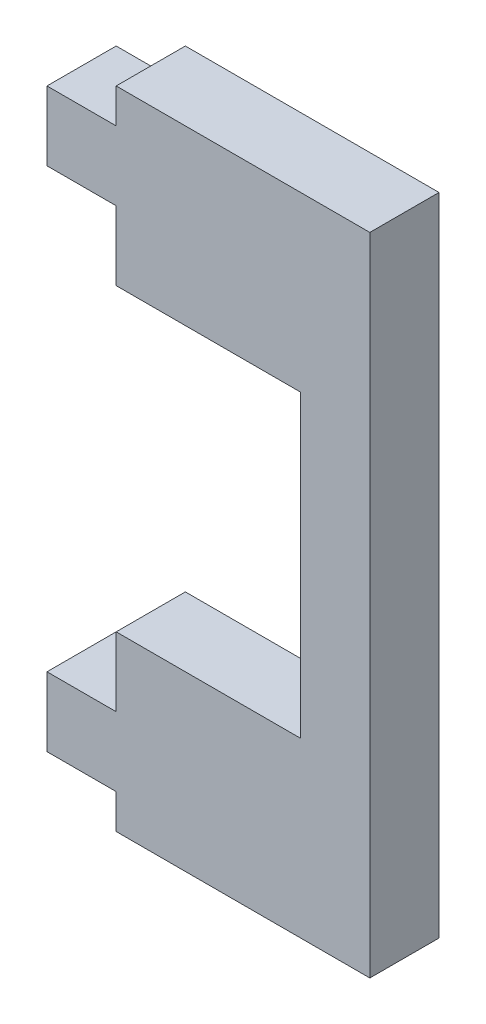
ISO-10303-21;
HEADER;
FILE_DESCRIPTION(('STEP AP214'),'2;1');
FILE_NAME('part.step','',(''),(''),'','','');
FILE_SCHEMA(('AUTOMOTIVE_DESIGN { 1 0 10303 214 1 1 1 1 }'));
ENDSEC;
DATA;
#1=APPLICATION_CONTEXT('core data for automotive mechanical design processes');
#2=APPLICATION_PROTOCOL_DEFINITION('international standard','automotive_design',2000,#1);
#3=PRODUCT_CONTEXT('',#1,'mechanical');
#4=PRODUCT('Part','Part','',(#3));
#5=PRODUCT_RELATED_PRODUCT_CATEGORY('part','',(#4));
#6=PRODUCT_DEFINITION_FORMATION('','',#4);
#7=PRODUCT_DEFINITION_CONTEXT('part definition',#1,'design');
#8=PRODUCT_DEFINITION('design','',#6,#7);
#9=PRODUCT_DEFINITION_SHAPE('','',#8);
#10=(LENGTH_UNIT() NAMED_UNIT(*) SI_UNIT(.MILLI.,.METRE.));
#11=(NAMED_UNIT(*) PLANE_ANGLE_UNIT() SI_UNIT($,.RADIAN.));
#12=(NAMED_UNIT(*) SI_UNIT($,.STERADIAN.) SOLID_ANGLE_UNIT());
#13=UNCERTAINTY_MEASURE_WITH_UNIT(LENGTH_MEASURE(1.E-05),#10,'distance_accuracy_value','');
#14=(GEOMETRIC_REPRESENTATION_CONTEXT(3) GLOBAL_UNCERTAINTY_ASSIGNED_CONTEXT((#13)) GLOBAL_UNIT_ASSIGNED_CONTEXT((#10,
#11,#12)) REPRESENTATION_CONTEXT('',''));
#15=CARTESIAN_POINT('',(0.,0.,0.));
#16=DIRECTION('',(0.,0.,1.));
#17=DIRECTION('',(1.,0.,0.));
#18=AXIS2_PLACEMENT_3D('',#15,#16,#17);
#19=CARTESIAN_POINT('',(3.,14.,3.));
#20=DIRECTION('',(-1.,0.,0.));
#21=DIRECTION('',(0.,-1.,0.));
#22=AXIS2_PLACEMENT_3D('',#19,#20,#21);
#23=PLANE('',#22);
#24=DIRECTION('',(0.,1.,0.));
#25=VECTOR('',#24,1.);
#26=CARTESIAN_POINT('',(3.,14.,0.));
#27=LINE('',#26,#25);
#28=CARTESIAN_POINT('',(3.,-14.,0.));
#29=VERTEX_POINT('',#28);
#30=CARTESIAN_POINT('',(3.,14.,0.));
#31=VERTEX_POINT('',#30);
#32=EDGE_CURVE('E144',#29,#31,#27,.T.);
#33=ORIENTED_EDGE('',*,*,#32,.T.);
#34=DIRECTION('',(0.,0.,-1.));
#35=VECTOR('',#34,1.);
#36=CARTESIAN_POINT('',(3.,14.,3.));
#37=LINE('',#36,#35);
#38=CARTESIAN_POINT('',(3.,14.,3.));
#39=VERTEX_POINT('',#38);
#40=EDGE_CURVE('E11',#39,#31,#37,.T.);
#41=ORIENTED_EDGE('',*,*,#40,.F.);
#42=DIRECTION('',(0.,1.,0.));
#43=VECTOR('',#42,1.);
#44=CARTESIAN_POINT('',(3.,14.,3.));
#45=LINE('',#44,#43);
#46=CARTESIAN_POINT('',(3.,-14.,3.));
#47=VERTEX_POINT('',#46);
#48=EDGE_CURVE('E101',#47,#39,#45,.T.);
#49=ORIENTED_EDGE('',*,*,#48,.F.);
#50=DIRECTION('',(0.,0.,-1.));
#51=VECTOR('',#50,1.);
#52=CARTESIAN_POINT('',(3.,-14.,3.));
#53=LINE('',#52,#51);
#54=EDGE_CURVE('E218',#47,#29,#53,.T.);
#55=ORIENTED_EDGE('',*,*,#54,.T.);
#56=EDGE_LOOP('',(#33,#41,#49,#55));
#57=FACE_BOUND('',#56,.T.);
#58=ADVANCED_FACE('F41',(#57),#23,.F.);
#59=CARTESIAN_POINT('',(-8.,14.,3.));
#60=DIRECTION('',(0.,-1.,0.));
#61=DIRECTION('',(1.,0.,0.));
#62=AXIS2_PLACEMENT_3D('',#59,#60,#61);
#63=PLANE('',#62);
#64=DIRECTION('',(-1.,0.,0.));
#65=VECTOR('',#64,1.);
#66=CARTESIAN_POINT('',(-8.,14.,0.));
#67=LINE('',#66,#65);
#68=CARTESIAN_POINT('',(-8.,14.,0.));
#69=VERTEX_POINT('',#68);
#70=EDGE_CURVE('E146',#31,#69,#67,.T.);
#71=ORIENTED_EDGE('',*,*,#70,.T.);
#72=DIRECTION('',(0.,0.,-1.));
#73=VECTOR('',#72,1.);
#74=CARTESIAN_POINT('',(-8.,14.,3.));
#75=LINE('',#74,#73);
#76=CARTESIAN_POINT('',(-8.,14.,3.));
#77=VERTEX_POINT('',#76);
#78=EDGE_CURVE('E49',#77,#69,#75,.T.);
#79=ORIENTED_EDGE('',*,*,#78,.F.);
#80=DIRECTION('',(-1.,0.,0.));
#81=VECTOR('',#80,1.);
#82=CARTESIAN_POINT('',(-8.,14.,3.));
#83=LINE('',#82,#81);
#84=EDGE_CURVE('E195',#39,#77,#83,.T.);
#85=ORIENTED_EDGE('',*,*,#84,.F.);
#86=ORIENTED_EDGE('',*,*,#40,.T.);
#87=EDGE_LOOP('',(#71,#79,#85,#86));
#88=FACE_BOUND('',#87,.T.);
#89=ADVANCED_FACE('F316',(#88),#63,.F.);
#90=CARTESIAN_POINT('',(-8.,12.5,3.));
#91=DIRECTION('',(1.,0.,0.));
#92=DIRECTION('',(0.,0.,-1.));
#93=AXIS2_PLACEMENT_3D('',#90,#91,#92);
#94=PLANE('',#93);
#95=DIRECTION('',(0.,-1.,0.));
#96=VECTOR('',#95,1.);
#97=CARTESIAN_POINT('',(-8.,12.5,0.));
#98=LINE('',#97,#96);
#99=CARTESIAN_POINT('',(-8.,12.5,0.));
#100=VERTEX_POINT('',#99);
#101=EDGE_CURVE('E149',#69,#100,#98,.T.);
#102=ORIENTED_EDGE('',*,*,#101,.T.);
#103=DIRECTION('',(0.,0.,-1.));
#104=VECTOR('',#103,1.);
#105=CARTESIAN_POINT('',(-8.,12.5,3.));
#106=LINE('',#105,#104);
#107=CARTESIAN_POINT('',(-8.,12.5,3.));
#108=VERTEX_POINT('',#107);
#109=EDGE_CURVE('E167',#108,#100,#106,.T.);
#110=ORIENTED_EDGE('',*,*,#109,.F.);
#111=DIRECTION('',(0.,-1.,0.));
#112=VECTOR('',#111,1.);
#113=CARTESIAN_POINT('',(-8.,12.5,3.));
#114=LINE('',#113,#112);
#115=EDGE_CURVE('E176',#77,#108,#114,.T.);
#116=ORIENTED_EDGE('',*,*,#115,.F.);
#117=ORIENTED_EDGE('',*,*,#78,.T.);
#118=EDGE_LOOP('',(#102,#110,#116,#117));
#119=FACE_BOUND('',#118,.T.);
#120=ADVANCED_FACE('F174',(#119),#94,.F.);
#121=CARTESIAN_POINT('',(-8.,12.5,3.));
#122=DIRECTION('',(0.,-1.,0.));
#123=DIRECTION('',(1.,0.,0.));
#124=AXIS2_PLACEMENT_3D('',#121,#122,#123);
#125=PLANE('',#124);
#126=DIRECTION('',(-1.,0.,0.));
#127=VECTOR('',#126,1.);
#128=CARTESIAN_POINT('',(-8.,12.5,0.));
#129=LINE('',#128,#127);
#130=CARTESIAN_POINT('',(-11.,12.5,0.));
#131=VERTEX_POINT('',#130);
#132=EDGE_CURVE('E151',#100,#131,#129,.T.);
#133=ORIENTED_EDGE('',*,*,#132,.T.);
#134=DIRECTION('',(0.,0.,-1.));
#135=VECTOR('',#134,1.);
#136=CARTESIAN_POINT('',(-11.,12.5,3.));
#137=LINE('',#136,#135);
#138=CARTESIAN_POINT('',(-11.,12.5,3.));
#139=VERTEX_POINT('',#138);
#140=EDGE_CURVE('E164',#139,#131,#137,.T.);
#141=ORIENTED_EDGE('',*,*,#140,.F.);
#142=DIRECTION('',(-1.,0.,0.));
#143=VECTOR('',#142,1.);
#144=CARTESIAN_POINT('',(-8.,12.5,3.));
#145=LINE('',#144,#143);
#146=EDGE_CURVE('E191',#108,#139,#145,.T.);
#147=ORIENTED_EDGE('',*,*,#146,.F.);
#148=ORIENTED_EDGE('',*,*,#109,.T.);
#149=EDGE_LOOP('',(#133,#141,#147,#148));
#150=FACE_BOUND('',#149,.T.);
#151=ADVANCED_FACE('F187',(#150),#125,.F.);
#152=CARTESIAN_POINT('',(-11.,12.5,3.));
#153=DIRECTION('',(1.,0.,0.));
#154=DIRECTION('',(0.,1.,0.));
#155=AXIS2_PLACEMENT_3D('',#152,#153,#154);
#156=PLANE('',#155);
#157=DIRECTION('',(0.,-1.,0.));
#158=VECTOR('',#157,1.);
#159=CARTESIAN_POINT('',(-11.,12.5,0.));
#160=LINE('',#159,#158);
#161=CARTESIAN_POINT('',(-11.,9.5,0.));
#162=VERTEX_POINT('',#161);
#163=EDGE_CURVE('E153',#131,#162,#160,.T.);
#164=ORIENTED_EDGE('',*,*,#163,.T.);
#165=DIRECTION('',(0.,0.,-1.));
#166=VECTOR('',#165,1.);
#167=CARTESIAN_POINT('',(-11.,9.5,3.));
#168=LINE('',#167,#166);
#169=CARTESIAN_POINT('',(-11.,9.5,3.));
#170=VERTEX_POINT('',#169);
#171=EDGE_CURVE('E133',#170,#162,#168,.T.);
#172=ORIENTED_EDGE('',*,*,#171,.F.);
#173=DIRECTION('',(0.,-1.,0.));
#174=VECTOR('',#173,1.);
#175=CARTESIAN_POINT('',(-11.,12.5,3.));
#176=LINE('',#175,#174);
#177=EDGE_CURVE('E124',#139,#170,#176,.T.);
#178=ORIENTED_EDGE('',*,*,#177,.F.);
#179=ORIENTED_EDGE('',*,*,#140,.T.);
#180=EDGE_LOOP('',(#164,#172,#178,#179));
#181=FACE_BOUND('',#180,.T.);
#182=ADVANCED_FACE('F190',(#181),#156,.F.);
#183=CARTESIAN_POINT('',(-8.,9.5,3.));
#184=DIRECTION('',(0.,1.,0.));
#185=DIRECTION('',(-1.,0.,0.));
#186=AXIS2_PLACEMENT_3D('',#183,#184,#185);
#187=PLANE('',#186);
#188=DIRECTION('',(1.,0.,0.));
#189=VECTOR('',#188,1.);
#190=CARTESIAN_POINT('',(-8.,9.5,0.));
#191=LINE('',#190,#189);
#192=CARTESIAN_POINT('',(-8.,9.5,0.));
#193=VERTEX_POINT('',#192);
#194=EDGE_CURVE('E132',#162,#193,#191,.T.);
#195=ORIENTED_EDGE('',*,*,#194,.T.);
#196=DIRECTION('',(0.,0.,-1.));
#197=VECTOR('',#196,1.);
#198=CARTESIAN_POINT('',(-8.,9.5,3.));
#199=LINE('',#198,#197);
#200=CARTESIAN_POINT('',(-8.,9.5,3.));
#201=VERTEX_POINT('',#200);
#202=EDGE_CURVE('E129',#201,#193,#199,.T.);
#203=ORIENTED_EDGE('',*,*,#202,.F.);
#204=DIRECTION('',(1.,0.,0.));
#205=VECTOR('',#204,1.);
#206=CARTESIAN_POINT('',(-8.,9.5,3.));
#207=LINE('',#206,#205);
#208=EDGE_CURVE('E118',#170,#201,#207,.T.);
#209=ORIENTED_EDGE('',*,*,#208,.F.);
#210=ORIENTED_EDGE('',*,*,#171,.T.);
#211=EDGE_LOOP('',(#195,#203,#209,#210));
#212=FACE_BOUND('',#211,.T.);
#213=ADVANCED_FACE('F130',(#212),#187,.F.);
#214=CARTESIAN_POINT('',(-8.,6.5,3.));
#215=DIRECTION('',(1.,0.,0.));
#216=DIRECTION('',(0.,1.,0.));
#217=AXIS2_PLACEMENT_3D('',#214,#215,#216);
#218=PLANE('',#217);
#219=DIRECTION('',(0.,-1.,0.));
#220=VECTOR('',#219,1.);
#221=CARTESIAN_POINT('',(-8.,6.5,0.));
#222=LINE('',#221,#220);
#223=CARTESIAN_POINT('',(-8.,6.5,0.));
#224=VERTEX_POINT('',#223);
#225=EDGE_CURVE('E87',#193,#224,#222,.T.);
#226=ORIENTED_EDGE('',*,*,#225,.T.);
#227=DIRECTION('',(0.,0.,-1.));
#228=VECTOR('',#227,1.);
#229=CARTESIAN_POINT('',(-8.,6.5,3.));
#230=LINE('',#229,#228);
#231=CARTESIAN_POINT('',(-8.,6.5,3.));
#232=VERTEX_POINT('',#231);
#233=EDGE_CURVE('E134',#232,#224,#230,.T.);
#234=ORIENTED_EDGE('',*,*,#233,.F.);
#235=DIRECTION('',(0.,-1.,0.));
#236=VECTOR('',#235,1.);
#237=CARTESIAN_POINT('',(-8.,6.5,3.));
#238=LINE('',#237,#236);
#239=EDGE_CURVE('E122',#201,#232,#238,.T.);
#240=ORIENTED_EDGE('',*,*,#239,.F.);
#241=ORIENTED_EDGE('',*,*,#202,.T.);
#242=EDGE_LOOP('',(#226,#234,#240,#241));
#243=FACE_BOUND('',#242,.T.);
#244=ADVANCED_FACE('F136',(#243),#218,.F.);
#245=CARTESIAN_POINT('',(-8.,6.5,3.));
#246=DIRECTION('',(0.,1.,0.));
#247=DIRECTION('',(-1.,0.,0.));
#248=AXIS2_PLACEMENT_3D('',#245,#246,#247);
#249=PLANE('',#248);
#250=DIRECTION('',(1.,0.,0.));
#251=VECTOR('',#250,1.);
#252=CARTESIAN_POINT('',(-8.,6.5,0.));
#253=LINE('',#252,#251);
#254=CARTESIAN_POINT('',(0.,6.5,0.));
#255=VERTEX_POINT('',#254);
#256=EDGE_CURVE('E93',#224,#255,#253,.T.);
#257=ORIENTED_EDGE('',*,*,#256,.T.);
#258=DIRECTION('',(0.,0.,-1.));
#259=VECTOR('',#258,1.);
#260=CARTESIAN_POINT('',(0.,6.5,3.));
#261=LINE('',#260,#259);
#262=CARTESIAN_POINT('',(0.,6.5,3.));
#263=VERTEX_POINT('',#262);
#264=EDGE_CURVE('E143',#263,#255,#261,.T.);
#265=ORIENTED_EDGE('',*,*,#264,.F.);
#266=DIRECTION('',(1.,0.,0.));
#267=VECTOR('',#266,1.);
#268=CARTESIAN_POINT('',(-8.,6.5,3.));
#269=LINE('',#268,#267);
#270=EDGE_CURVE('E57',#232,#263,#269,.T.);
#271=ORIENTED_EDGE('',*,*,#270,.F.);
#272=ORIENTED_EDGE('',*,*,#233,.T.);
#273=EDGE_LOOP('',(#257,#265,#271,#272));
#274=FACE_BOUND('',#273,.T.);
#275=ADVANCED_FACE('F333',(#274),#249,.F.);
#276=CARTESIAN_POINT('',(0.,6.5,3.));
#277=DIRECTION('',(1.,0.,0.));
#278=DIRECTION('',(0.,1.,0.));
#279=AXIS2_PLACEMENT_3D('',#276,#277,#278);
#280=PLANE('',#279);
#281=DIRECTION('',(0.,-1.,0.));
#282=VECTOR('',#281,1.);
#283=CARTESIAN_POINT('',(0.,6.5,0.));
#284=LINE('',#283,#282);
#285=CARTESIAN_POINT('',(0.,-6.5,0.));
#286=VERTEX_POINT('',#285);
#287=EDGE_CURVE('E158',#255,#286,#284,.T.);
#288=ORIENTED_EDGE('',*,*,#287,.T.);
#289=DIRECTION('',(0.,0.,-1.));
#290=VECTOR('',#289,1.);
#291=CARTESIAN_POINT('',(0.,-6.5,3.));
#292=LINE('',#291,#290);
#293=CARTESIAN_POINT('',(0.,-6.5,3.));
#294=VERTEX_POINT('',#293);
#295=EDGE_CURVE('E147',#294,#286,#292,.T.);
#296=ORIENTED_EDGE('',*,*,#295,.F.);
#297=DIRECTION('',(0.,-1.,0.));
#298=VECTOR('',#297,1.);
#299=CARTESIAN_POINT('',(0.,6.5,3.));
#300=LINE('',#299,#298);
#301=EDGE_CURVE('E138',#263,#294,#300,.T.);
#302=ORIENTED_EDGE('',*,*,#301,.F.);
#303=ORIENTED_EDGE('',*,*,#264,.T.);
#304=EDGE_LOOP('',(#288,#296,#302,#303));
#305=FACE_BOUND('',#304,.T.);
#306=ADVANCED_FACE('F336',(#305),#280,.F.);
#307=CARTESIAN_POINT('',(0.,0.,3.));
#308=DIRECTION('',(0.,0.,-1.));
#309=DIRECTION('',(-1.,0.,0.));
#310=AXIS2_PLACEMENT_3D('',#307,#308,#309);
#311=PLANE('',#310);
#312=ORIENTED_EDGE('',*,*,#301,.T.);
#313=DIRECTION('',(1.,0.,0.));
#314=VECTOR('',#313,1.);
#315=CARTESIAN_POINT('',(-8.,-6.5,3.));
#316=LINE('',#315,#314);
#317=CARTESIAN_POINT('',(-8.,-6.5,3.));
#318=VERTEX_POINT('',#317);
#319=EDGE_CURVE('E225',#318,#294,#316,.T.);
#320=ORIENTED_EDGE('',*,*,#319,.F.);
#321=DIRECTION('',(0.,1.,0.));
#322=VECTOR('',#321,1.);
#323=CARTESIAN_POINT('',(-8.,-6.5,3.));
#324=LINE('',#323,#322);
#325=CARTESIAN_POINT('',(-8.,-9.5,3.));
#326=VERTEX_POINT('',#325);
#327=EDGE_CURVE('E258',#326,#318,#324,.T.);
#328=ORIENTED_EDGE('',*,*,#327,.F.);
#329=DIRECTION('',(1.,0.,0.));
#330=VECTOR('',#329,1.);
#331=CARTESIAN_POINT('',(-8.,-9.5,3.));
#332=LINE('',#331,#330);
#333=CARTESIAN_POINT('',(-11.,-9.5,3.));
#334=VERTEX_POINT('',#333);
#335=EDGE_CURVE('E255',#334,#326,#332,.T.);
#336=ORIENTED_EDGE('',*,*,#335,.F.);
#337=DIRECTION('',(0.,1.,0.));
#338=VECTOR('',#337,1.);
#339=CARTESIAN_POINT('',(-11.,-12.5,3.));
#340=LINE('',#339,#338);
#341=CARTESIAN_POINT('',(-11.,-12.5,3.));
#342=VERTEX_POINT('',#341);
#343=EDGE_CURVE('E252',#342,#334,#340,.T.);
#344=ORIENTED_EDGE('',*,*,#343,.F.);
#345=DIRECTION('',(-1.,0.,0.));
#346=VECTOR('',#345,1.);
#347=CARTESIAN_POINT('',(-8.,-12.5,3.));
#348=LINE('',#347,#346);
#349=CARTESIAN_POINT('',(-8.,-12.5,3.));
#350=VERTEX_POINT('',#349);
#351=EDGE_CURVE('E249',#350,#342,#348,.T.);
#352=ORIENTED_EDGE('',*,*,#351,.F.);
#353=DIRECTION('',(0.,1.,0.));
#354=VECTOR('',#353,1.);
#355=CARTESIAN_POINT('',(-8.,-12.5,3.));
#356=LINE('',#355,#354);
#357=CARTESIAN_POINT('',(-8.,-14.,3.));
#358=VERTEX_POINT('',#357);
#359=EDGE_CURVE('E246',#358,#350,#356,.T.);
#360=ORIENTED_EDGE('',*,*,#359,.F.);
#361=DIRECTION('',(-1.,0.,0.));
#362=VECTOR('',#361,1.);
#363=CARTESIAN_POINT('',(-8.,-14.,3.));
#364=LINE('',#363,#362);
#365=EDGE_CURVE('E221',#47,#358,#364,.T.);
#366=ORIENTED_EDGE('',*,*,#365,.F.);
#367=ORIENTED_EDGE('',*,*,#48,.T.);
#368=ORIENTED_EDGE('',*,*,#84,.T.);
#369=ORIENTED_EDGE('',*,*,#115,.T.);
#370=ORIENTED_EDGE('',*,*,#146,.T.);
#371=ORIENTED_EDGE('',*,*,#177,.T.);
#372=ORIENTED_EDGE('',*,*,#208,.T.);
#373=ORIENTED_EDGE('',*,*,#239,.T.);
#374=ORIENTED_EDGE('',*,*,#270,.T.);
#375=EDGE_LOOP('',(#312,#320,#328,#336,#344,#352,#360,#366,#367,#368,#369,#370,#371,#372,#373,#374));
#376=FACE_BOUND('',#375,.T.);
#377=ADVANCED_FACE('F120',(#376),#311,.F.);
#378=CARTESIAN_POINT('',(0.,0.,0.));
#379=DIRECTION('',(0.,0.,-1.));
#380=DIRECTION('',(-1.,0.,0.));
#381=AXIS2_PLACEMENT_3D('',#378,#379,#380);
#382=PLANE('',#381);
#383=ORIENTED_EDGE('',*,*,#32,.F.);
#384=DIRECTION('',(-1.,0.,0.));
#385=VECTOR('',#384,1.);
#386=CARTESIAN_POINT('',(-8.,-14.,0.));
#387=LINE('',#386,#385);
#388=CARTESIAN_POINT('',(-8.,-14.,0.));
#389=VERTEX_POINT('',#388);
#390=EDGE_CURVE('E222',#29,#389,#387,.T.);
#391=ORIENTED_EDGE('',*,*,#390,.T.);
#392=DIRECTION('',(0.,1.,0.));
#393=VECTOR('',#392,1.);
#394=CARTESIAN_POINT('',(-8.,-12.5,0.));
#395=LINE('',#394,#393);
#396=CARTESIAN_POINT('',(-8.,-12.5,0.));
#397=VERTEX_POINT('',#396);
#398=EDGE_CURVE('E226',#389,#397,#395,.T.);
#399=ORIENTED_EDGE('',*,*,#398,.T.);
#400=DIRECTION('',(-1.,0.,0.));
#401=VECTOR('',#400,1.);
#402=CARTESIAN_POINT('',(-8.,-12.5,0.));
#403=LINE('',#402,#401);
#404=CARTESIAN_POINT('',(-11.,-12.5,0.));
#405=VERTEX_POINT('',#404);
#406=EDGE_CURVE('E229',#397,#405,#403,.T.);
#407=ORIENTED_EDGE('',*,*,#406,.T.);
#408=DIRECTION('',(0.,1.,0.));
#409=VECTOR('',#408,1.);
#410=CARTESIAN_POINT('',(-11.,-12.5,0.));
#411=LINE('',#410,#409);
#412=CARTESIAN_POINT('',(-11.,-9.5,0.));
#413=VERTEX_POINT('',#412);
#414=EDGE_CURVE('E232',#405,#413,#411,.T.);
#415=ORIENTED_EDGE('',*,*,#414,.T.);
#416=DIRECTION('',(1.,0.,0.));
#417=VECTOR('',#416,1.);
#418=CARTESIAN_POINT('',(-8.,-9.5,0.));
#419=LINE('',#418,#417);
#420=CARTESIAN_POINT('',(-8.,-9.5,0.));
#421=VERTEX_POINT('',#420);
#422=EDGE_CURVE('E235',#413,#421,#419,.T.);
#423=ORIENTED_EDGE('',*,*,#422,.T.);
#424=DIRECTION('',(0.,1.,0.));
#425=VECTOR('',#424,1.);
#426=CARTESIAN_POINT('',(-8.,-6.5,0.));
#427=LINE('',#426,#425);
#428=CARTESIAN_POINT('',(-8.,-6.5,0.));
#429=VERTEX_POINT('',#428);
#430=EDGE_CURVE('E238',#421,#429,#427,.T.);
#431=ORIENTED_EDGE('',*,*,#430,.T.);
#432=DIRECTION('',(1.,0.,0.));
#433=VECTOR('',#432,1.);
#434=CARTESIAN_POINT('',(-8.,-6.5,0.));
#435=LINE('',#434,#433);
#436=EDGE_CURVE('E241',#429,#286,#435,.T.);
#437=ORIENTED_EDGE('',*,*,#436,.T.);
#438=ORIENTED_EDGE('',*,*,#287,.F.);
#439=ORIENTED_EDGE('',*,*,#256,.F.);
#440=ORIENTED_EDGE('',*,*,#225,.F.);
#441=ORIENTED_EDGE('',*,*,#194,.F.);
#442=ORIENTED_EDGE('',*,*,#163,.F.);
#443=ORIENTED_EDGE('',*,*,#132,.F.);
#444=ORIENTED_EDGE('',*,*,#101,.F.);
#445=ORIENTED_EDGE('',*,*,#70,.F.);
#446=EDGE_LOOP('',(#383,#391,#399,#407,#415,#423,#431,#437,#438,#439,#440,#441,#442,#443,#444,#445));
#447=FACE_BOUND('',#446,.T.);
#448=ADVANCED_FACE('F183',(#447),#382,.T.);
#449=CARTESIAN_POINT('',(-8.,-6.5,3.));
#450=DIRECTION('',(0.,1.,0.));
#451=DIRECTION('',(-1.,0.,0.));
#452=AXIS2_PLACEMENT_3D('',#449,#450,#451);
#453=PLANE('',#452);
#454=ORIENTED_EDGE('',*,*,#436,.F.);
#455=DIRECTION('',(0.,0.,-1.));
#456=VECTOR('',#455,1.);
#457=CARTESIAN_POINT('',(-8.,-6.5,3.));
#458=LINE('',#457,#456);
#459=EDGE_CURVE('E200',#318,#429,#458,.T.);
#460=ORIENTED_EDGE('',*,*,#459,.F.);
#461=ORIENTED_EDGE('',*,*,#319,.T.);
#462=ORIENTED_EDGE('',*,*,#295,.T.);
#463=EDGE_LOOP('',(#454,#460,#461,#462));
#464=FACE_BOUND('',#463,.T.);
#465=ADVANCED_FACE('F267',(#464),#453,.T.);
#466=CARTESIAN_POINT('',(-8.,-6.5,3.));
#467=DIRECTION('',(-1.,0.,0.));
#468=DIRECTION('',(0.,-1.,0.));
#469=AXIS2_PLACEMENT_3D('',#466,#467,#468);
#470=PLANE('',#469);
#471=ORIENTED_EDGE('',*,*,#430,.F.);
#472=DIRECTION('',(0.,0.,-1.));
#473=VECTOR('',#472,1.);
#474=CARTESIAN_POINT('',(-8.,-9.5,3.));
#475=LINE('',#474,#473);
#476=EDGE_CURVE('E203',#326,#421,#475,.T.);
#477=ORIENTED_EDGE('',*,*,#476,.F.);
#478=ORIENTED_EDGE('',*,*,#327,.T.);
#479=ORIENTED_EDGE('',*,*,#459,.T.);
#480=EDGE_LOOP('',(#471,#477,#478,#479));
#481=FACE_BOUND('',#480,.T.);
#482=ADVANCED_FACE('F280',(#481),#470,.T.);
#483=CARTESIAN_POINT('',(-8.,-9.5,3.));
#484=DIRECTION('',(0.,1.,0.));
#485=DIRECTION('',(-1.,0.,0.));
#486=AXIS2_PLACEMENT_3D('',#483,#484,#485);
#487=PLANE('',#486);
#488=ORIENTED_EDGE('',*,*,#422,.F.);
#489=DIRECTION('',(0.,0.,-1.));
#490=VECTOR('',#489,1.);
#491=CARTESIAN_POINT('',(-11.,-9.5,3.));
#492=LINE('',#491,#490);
#493=EDGE_CURVE('E206',#334,#413,#492,.T.);
#494=ORIENTED_EDGE('',*,*,#493,.F.);
#495=ORIENTED_EDGE('',*,*,#335,.T.);
#496=ORIENTED_EDGE('',*,*,#476,.T.);
#497=EDGE_LOOP('',(#488,#494,#495,#496));
#498=FACE_BOUND('',#497,.T.);
#499=ADVANCED_FACE('F287',(#498),#487,.T.);
#500=CARTESIAN_POINT('',(-11.,-12.5,3.));
#501=DIRECTION('',(-1.,0.,0.));
#502=DIRECTION('',(0.,-1.,0.));
#503=AXIS2_PLACEMENT_3D('',#500,#501,#502);
#504=PLANE('',#503);
#505=ORIENTED_EDGE('',*,*,#414,.F.);
#506=DIRECTION('',(0.,0.,-1.));
#507=VECTOR('',#506,1.);
#508=CARTESIAN_POINT('',(-11.,-12.5,3.));
#509=LINE('',#508,#507);
#510=EDGE_CURVE('E209',#342,#405,#509,.T.);
#511=ORIENTED_EDGE('',*,*,#510,.F.);
#512=ORIENTED_EDGE('',*,*,#343,.T.);
#513=ORIENTED_EDGE('',*,*,#493,.T.);
#514=EDGE_LOOP('',(#505,#511,#512,#513));
#515=FACE_BOUND('',#514,.T.);
#516=ADVANCED_FACE('F350',(#515),#504,.T.);
#517=CARTESIAN_POINT('',(-8.,-12.5,3.));
#518=DIRECTION('',(0.,-1.,0.));
#519=DIRECTION('',(1.,0.,0.));
#520=AXIS2_PLACEMENT_3D('',#517,#518,#519);
#521=PLANE('',#520);
#522=ORIENTED_EDGE('',*,*,#406,.F.);
#523=DIRECTION('',(0.,0.,-1.));
#524=VECTOR('',#523,1.);
#525=CARTESIAN_POINT('',(-8.,-12.5,3.));
#526=LINE('',#525,#524);
#527=EDGE_CURVE('E212',#350,#397,#526,.T.);
#528=ORIENTED_EDGE('',*,*,#527,.F.);
#529=ORIENTED_EDGE('',*,*,#351,.T.);
#530=ORIENTED_EDGE('',*,*,#510,.T.);
#531=EDGE_LOOP('',(#522,#528,#529,#530));
#532=FACE_BOUND('',#531,.T.);
#533=ADVANCED_FACE('F312',(#532),#521,.T.);
#534=CARTESIAN_POINT('',(-8.,-12.5,3.));
#535=DIRECTION('',(-1.,0.,0.));
#536=DIRECTION('',(0.,0.,1.));
#537=AXIS2_PLACEMENT_3D('',#534,#535,#536);
#538=PLANE('',#537);
#539=ORIENTED_EDGE('',*,*,#398,.F.);
#540=DIRECTION('',(0.,0.,-1.));
#541=VECTOR('',#540,1.);
#542=CARTESIAN_POINT('',(-8.,-14.,3.));
#543=LINE('',#542,#541);
#544=EDGE_CURVE('E215',#358,#389,#543,.T.);
#545=ORIENTED_EDGE('',*,*,#544,.F.);
#546=ORIENTED_EDGE('',*,*,#359,.T.);
#547=ORIENTED_EDGE('',*,*,#527,.T.);
#548=EDGE_LOOP('',(#539,#545,#546,#547));
#549=FACE_BOUND('',#548,.T.);
#550=ADVANCED_FACE('F307',(#549),#538,.T.);
#551=CARTESIAN_POINT('',(-8.,-14.,3.));
#552=DIRECTION('',(0.,-1.,0.));
#553=DIRECTION('',(1.,0.,0.));
#554=AXIS2_PLACEMENT_3D('',#551,#552,#553);
#555=PLANE('',#554);
#556=ORIENTED_EDGE('',*,*,#390,.F.);
#557=ORIENTED_EDGE('',*,*,#54,.F.);
#558=ORIENTED_EDGE('',*,*,#365,.T.);
#559=ORIENTED_EDGE('',*,*,#544,.T.);
#560=EDGE_LOOP('',(#556,#557,#558,#559));
#561=FACE_BOUND('',#560,.T.);
#562=ADVANCED_FACE('F305',(#561),#555,.T.);
#563=CLOSED_SHELL('',(#58,#89,#120,#151,#182,#213,#244,#275,#306,#377,#448,#465,#482,#499,#516,
#533,#550,#562));
#564=MANIFOLD_SOLID_BREP('B2',#563);
#565=ADVANCED_BREP_SHAPE_REPRESENTATION('',(#18,#564),#14);
#566=SHAPE_DEFINITION_REPRESENTATION(#9,#565);
ENDSEC;
END-ISO-10303-21;
